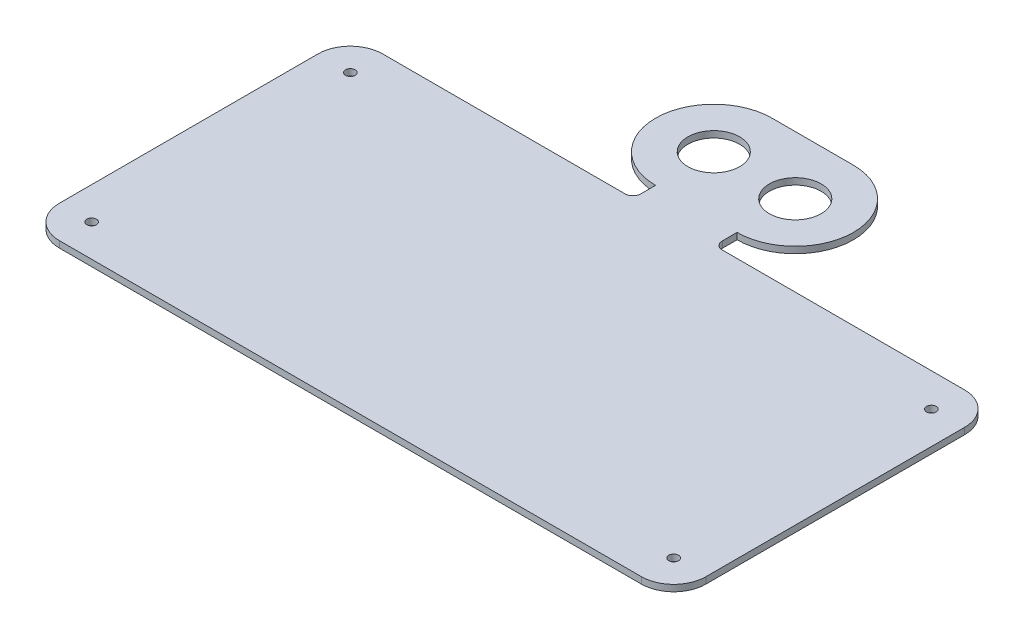
ISO-10303-21;
HEADER;
FILE_DESCRIPTION(('STEP AP214'),'2;1');
FILE_NAME('part.step','',(''),(''),'','','');
FILE_SCHEMA(('AUTOMOTIVE_DESIGN { 1 0 10303 214 1 1 1 1 }'));
ENDSEC;
DATA;
#1=APPLICATION_CONTEXT('core data for automotive mechanical design processes');
#2=APPLICATION_PROTOCOL_DEFINITION('international standard','automotive_design',2000,#1);
#3=PRODUCT_CONTEXT('',#1,'mechanical');
#4=PRODUCT('Part','Part','',(#3));
#5=PRODUCT_RELATED_PRODUCT_CATEGORY('part','',(#4));
#6=PRODUCT_DEFINITION_FORMATION('','',#4);
#7=PRODUCT_DEFINITION_CONTEXT('part definition',#1,'design');
#8=PRODUCT_DEFINITION('design','',#6,#7);
#9=PRODUCT_DEFINITION_SHAPE('','',#8);
#10=(LENGTH_UNIT() NAMED_UNIT(*) SI_UNIT(.MILLI.,.METRE.));
#11=(NAMED_UNIT(*) PLANE_ANGLE_UNIT() SI_UNIT($,.RADIAN.));
#12=(NAMED_UNIT(*) SI_UNIT($,.STERADIAN.) SOLID_ANGLE_UNIT());
#13=UNCERTAINTY_MEASURE_WITH_UNIT(LENGTH_MEASURE(1.E-05),#10,'distance_accuracy_value','');
#14=(GEOMETRIC_REPRESENTATION_CONTEXT(3) GLOBAL_UNCERTAINTY_ASSIGNED_CONTEXT((#13)) GLOBAL_UNIT_ASSIGNED_CONTEXT((#10,
#11,#12)) REPRESENTATION_CONTEXT('',''));
#15=CARTESIAN_POINT('',(0.,0.,0.));
#16=DIRECTION('',(0.,0.,1.));
#17=DIRECTION('',(1.,0.,0.));
#18=AXIS2_PLACEMENT_3D('',#15,#16,#17);
#19=CARTESIAN_POINT('',(0.00288129372301296,2.,-105.910949595272));
#20=DIRECTION('',(2.72048710067969E-05,0.,-0.999999999629947));
#21=DIRECTION('',(-0.999999999629948,0.,-2.72048710067969E-05));
#22=AXIS2_PLACEMENT_3D('',#19,#20,#21);
#23=PLANE('',#22);
#24=DIRECTION('',(0.999999999629948,0.,2.72048710067969E-05));
#25=VECTOR('',#24,1.);
#26=CARTESIAN_POINT('',(0.00288129372301296,0.,-105.910949595272));
#27=LINE('',#26,#25);
#28=CARTESIAN_POINT('',(34.5048266485384,0.,-105.910010974298));
#29=VERTEX_POINT('',#28);
#30=CARTESIAN_POINT('',(59.9279761931842,0.,-105.909319340794));
#31=VERTEX_POINT('',#30);
#32=EDGE_CURVE('E395',#29,#31,#27,.T.);
#33=ORIENTED_EDGE('',*,*,#32,.F.);
#34=DIRECTION('',(0.,-1.,0.));
#35=VECTOR('',#34,1.);
#36=CARTESIAN_POINT('',(34.5048266485384,2.,-105.910010974298));
#37=LINE('',#36,#35);
#38=CARTESIAN_POINT('',(34.5048266485384,2.,-105.910010974298));
#39=VERTEX_POINT('',#38);
#40=EDGE_CURVE('E12',#39,#29,#37,.T.);
#41=ORIENTED_EDGE('',*,*,#40,.F.);
#42=DIRECTION('',(0.999999999629948,0.,2.72048710067969E-05));
#43=VECTOR('',#42,1.);
#44=CARTESIAN_POINT('',(0.00288129372301296,2.,-105.910949595272));
#45=LINE('',#44,#43);
#46=CARTESIAN_POINT('',(59.9279761931842,2.,-105.909319340794));
#47=VERTEX_POINT('',#46);
#48=EDGE_CURVE('E319',#39,#47,#45,.T.);
#49=ORIENTED_EDGE('',*,*,#48,.T.);
#50=DIRECTION('',(0.,-1.,0.));
#51=VECTOR('',#50,1.);
#52=CARTESIAN_POINT('',(59.9279761931842,2.,-105.909319340794));
#53=LINE('',#52,#51);
#54=EDGE_CURVE('E145',#47,#31,#53,.T.);
#55=ORIENTED_EDGE('',*,*,#54,.T.);
#56=EDGE_LOOP('',(#33,#41,#49,#55));
#57=FACE_BOUND('',#56,.T.);
#58=ADVANCED_FACE('F47',(#57),#23,.T.);
#59=CARTESIAN_POINT('',(34.5048266485384,2.,-87.9100109876203));
#60=DIRECTION('',(0.,-1.,0.));
#61=DIRECTION('',(0.,0.,-1.));
#62=AXIS2_PLACEMENT_3D('',#59,#60,#61);
#63=CYLINDRICAL_SURFACE('',#62,17.9999999866781);
#64=CARTESIAN_POINT('',(34.5048266485384,0.,-87.9100109876203));
#65=DIRECTION('',(0.,1.,0.));
#66=DIRECTION('',(0.,0.,1.));
#67=AXIS2_PLACEMENT_3D('',#64,#65,#66);
#68=CIRCLE('',#67,17.9999999866781);
#69=CARTESIAN_POINT('',(34.5048266485384,0.,-69.9100110009422));
#70=VERTEX_POINT('',#69);
#71=EDGE_CURVE('E269',#29,#70,#68,.T.);
#72=ORIENTED_EDGE('',*,*,#71,.T.);
#73=DIRECTION('',(0.,-1.,0.));
#74=VECTOR('',#73,1.);
#75=CARTESIAN_POINT('',(34.5048266485384,2.,-69.9100110009422));
#76=LINE('',#75,#74);
#77=CARTESIAN_POINT('',(34.5048266485384,2.,-69.9100110009422));
#78=VERTEX_POINT('',#77);
#79=EDGE_CURVE('E59',#78,#70,#76,.T.);
#80=ORIENTED_EDGE('',*,*,#79,.F.);
#81=CARTESIAN_POINT('',(34.5048266485384,2.,-87.9100109876203));
#82=DIRECTION('',(0.,1.,0.));
#83=DIRECTION('',(0.,0.,1.));
#84=AXIS2_PLACEMENT_3D('',#81,#82,#83);
#85=CIRCLE('',#84,17.9999999866781);
#86=EDGE_CURVE('E313',#39,#78,#85,.T.);
#87=ORIENTED_EDGE('',*,*,#86,.F.);
#88=ORIENTED_EDGE('',*,*,#40,.T.);
#89=EDGE_LOOP('',(#72,#80,#87,#88));
#90=FACE_BOUND('',#89,.T.);
#91=ADVANCED_FACE('F454',(#90),#63,.T.);
#92=CARTESIAN_POINT('',(34.5048266485384,2.,0.));
#93=DIRECTION('',(1.,0.,0.));
#94=DIRECTION('',(0.,0.,-1.));
#95=AXIS2_PLACEMENT_3D('',#92,#93,#94);
#96=PLANE('',#95);
#97=DIRECTION('',(0.,0.,1.));
#98=VECTOR('',#97,1.);
#99=CARTESIAN_POINT('',(34.5048266485384,0.,0.));
#100=LINE('',#99,#98);
#101=CARTESIAN_POINT('',(34.5048266485384,0.,-65.3744840213346));
#102=VERTEX_POINT('',#101);
#103=EDGE_CURVE('E262',#70,#102,#100,.T.);
#104=ORIENTED_EDGE('',*,*,#103,.T.);
#105=DIRECTION('',(0.,-1.,0.));
#106=VECTOR('',#105,1.);
#107=CARTESIAN_POINT('',(34.5048266485384,2.,-65.3744840213346));
#108=LINE('',#107,#106);
#109=CARTESIAN_POINT('',(34.5048266485384,2.,-65.3744840213346));
#110=VERTEX_POINT('',#109);
#111=EDGE_CURVE('E301',#110,#102,#108,.T.);
#112=ORIENTED_EDGE('',*,*,#111,.F.);
#113=DIRECTION('',(0.,0.,1.));
#114=VECTOR('',#113,1.);
#115=CARTESIAN_POINT('',(34.5048266485384,2.,0.));
#116=LINE('',#115,#114);
#117=EDGE_CURVE('E318',#78,#110,#116,.T.);
#118=ORIENTED_EDGE('',*,*,#117,.F.);
#119=ORIENTED_EDGE('',*,*,#79,.T.);
#120=EDGE_LOOP('',(#104,#112,#118,#119));
#121=FACE_BOUND('',#120,.T.);
#122=ADVANCED_FACE('F459',(#121),#96,.F.);
#123=CARTESIAN_POINT('',(32.0178449764047,2.,-65.3744840213346));
#124=DIRECTION('',(0.,-1.,0.));
#125=DIRECTION('',(0.,0.,-1.));
#126=AXIS2_PLACEMENT_3D('',#123,#124,#125);
#127=CYLINDRICAL_SURFACE('',#126,2.48698167213371);
#128=CARTESIAN_POINT('',(32.0178449764047,0.,-65.3744840213346));
#129=DIRECTION('',(0.,1.,0.));
#130=DIRECTION('',(0.,0.,1.));
#131=AXIS2_PLACEMENT_3D('',#128,#129,#130);
#132=CIRCLE('',#131,2.48698167213371);
#133=CARTESIAN_POINT('',(32.3516870103431,0.,-62.9100109876203));
#134=VERTEX_POINT('',#133);
#135=EDGE_CURVE('E268',#102,#134,#132,.F.);
#136=ORIENTED_EDGE('',*,*,#135,.T.);
#137=DIRECTION('',(0.,-1.,0.));
#138=VECTOR('',#137,1.);
#139=CARTESIAN_POINT('',(32.3516870103431,2.,-62.9100109876203));
#140=LINE('',#139,#138);
#141=CARTESIAN_POINT('',(32.3516870103431,2.,-62.9100109876203));
#142=VERTEX_POINT('',#141);
#143=EDGE_CURVE('E295',#142,#134,#140,.T.);
#144=ORIENTED_EDGE('',*,*,#143,.F.);
#145=CARTESIAN_POINT('',(32.0178449764047,2.,-65.3744840213346));
#146=DIRECTION('',(0.,1.,0.));
#147=DIRECTION('',(0.,0.,1.));
#148=AXIS2_PLACEMENT_3D('',#145,#146,#147);
#149=CIRCLE('',#148,2.48698167213371);
#150=EDGE_CURVE('E326',#110,#142,#149,.F.);
#151=ORIENTED_EDGE('',*,*,#150,.F.);
#152=ORIENTED_EDGE('',*,*,#111,.T.);
#153=EDGE_LOOP('',(#136,#144,#151,#152));
#154=FACE_BOUND('',#153,.T.);
#155=ADVANCED_FACE('F729',(#154),#127,.F.);
#156=CARTESIAN_POINT('',(0.,2.,-62.9100109876203));
#157=DIRECTION('',(0.,0.,-1.));
#158=DIRECTION('',(-1.,0.,0.));
#159=AXIS2_PLACEMENT_3D('',#156,#157,#158);
#160=PLANE('',#159);
#161=DIRECTION('',(1.,0.,0.));
#162=VECTOR('',#161,1.);
#163=CARTESIAN_POINT('',(0.,0.,-62.9100109876203));
#164=LINE('',#163,#162);
#165=CARTESIAN_POINT('',(-42.8927873054641,0.,-62.9100109876203));
#166=VERTEX_POINT('',#165);
#167=EDGE_CURVE('E275',#166,#134,#164,.T.);
#168=ORIENTED_EDGE('',*,*,#167,.F.);
#169=DIRECTION('',(0.,-1.,0.));
#170=VECTOR('',#169,1.);
#171=CARTESIAN_POINT('',(-42.8927873054641,2.,-62.9100109876203));
#172=LINE('',#171,#170);
#173=CARTESIAN_POINT('',(-42.8927873054641,2.,-62.9100109876203));
#174=VERTEX_POINT('',#173);
#175=EDGE_CURVE('E291',#174,#166,#172,.T.);
#176=ORIENTED_EDGE('',*,*,#175,.F.);
#177=DIRECTION('',(1.,0.,0.));
#178=VECTOR('',#177,1.);
#179=CARTESIAN_POINT('',(0.,2.,-62.9100109876203));
#180=LINE('',#179,#178);
#181=EDGE_CURVE('E328',#174,#142,#180,.T.);
#182=ORIENTED_EDGE('',*,*,#181,.T.);
#183=ORIENTED_EDGE('',*,*,#143,.T.);
#184=EDGE_LOOP('',(#168,#176,#182,#183));
#185=FACE_BOUND('',#184,.T.);
#186=ADVANCED_FACE('F718',(#185),#160,.T.);
#187=CARTESIAN_POINT('',(-42.8927873054641,2.,-52.9100109876203));
#188=DIRECTION('',(0.,-1.,0.));
#189=DIRECTION('',(0.,0.,-1.));
#190=AXIS2_PLACEMENT_3D('',#187,#188,#189);
#191=CYLINDRICAL_SURFACE('',#190,9.99999999999999);
#192=CARTESIAN_POINT('',(-42.8927873054641,0.,-52.9100109876203));
#193=DIRECTION('',(0.,1.,0.));
#194=DIRECTION('',(0.,0.,1.));
#195=AXIS2_PLACEMENT_3D('',#192,#193,#194);
#196=CIRCLE('',#195,9.99999999999999);
#197=CARTESIAN_POINT('',(-52.8927873054641,0.,-52.9100109876203));
#198=VERTEX_POINT('',#197);
#199=EDGE_CURVE('E280',#166,#198,#196,.T.);
#200=ORIENTED_EDGE('',*,*,#199,.T.);
#201=DIRECTION('',(0.,-1.,0.));
#202=VECTOR('',#201,1.);
#203=CARTESIAN_POINT('',(-52.8927873054641,2.,-52.9100109876203));
#204=LINE('',#203,#202);
#205=CARTESIAN_POINT('',(-52.8927873054641,2.,-52.9100109876203));
#206=VERTEX_POINT('',#205);
#207=EDGE_CURVE('E296',#206,#198,#204,.T.);
#208=ORIENTED_EDGE('',*,*,#207,.F.);
#209=CARTESIAN_POINT('',(-42.8927873054641,2.,-52.9100109876203));
#210=DIRECTION('',(0.,1.,0.));
#211=DIRECTION('',(0.,0.,1.));
#212=AXIS2_PLACEMENT_3D('',#209,#210,#211);
#213=CIRCLE('',#212,9.99999999999999);
#214=EDGE_CURVE('E333',#174,#206,#213,.T.);
#215=ORIENTED_EDGE('',*,*,#214,.F.);
#216=ORIENTED_EDGE('',*,*,#175,.T.);
#217=EDGE_LOOP('',(#200,#208,#215,#216));
#218=FACE_BOUND('',#217,.T.);
#219=ADVANCED_FACE('F390',(#218),#191,.T.);
#220=CARTESIAN_POINT('',(-52.8927873054641,2.,0.));
#221=DIRECTION('',(1.,0.,0.));
#222=DIRECTION('',(0.,0.,-1.));
#223=AXIS2_PLACEMENT_3D('',#220,#221,#222);
#224=PLANE('',#223);
#225=DIRECTION('',(0.,0.,1.));
#226=VECTOR('',#225,1.);
#227=CARTESIAN_POINT('',(-52.8927873054641,0.,0.));
#228=LINE('',#227,#226);
#229=CARTESIAN_POINT('',(-52.8927873054641,0.,27.0899890123797));
#230=VERTEX_POINT('',#229);
#231=EDGE_CURVE('E346',#198,#230,#228,.T.);
#232=ORIENTED_EDGE('',*,*,#231,.T.);
#233=DIRECTION('',(0.,-1.,0.));
#234=VECTOR('',#233,1.);
#235=CARTESIAN_POINT('',(-52.8927873054641,2.,27.0899890123797));
#236=LINE('',#235,#234);
#237=CARTESIAN_POINT('',(-52.8927873054641,2.,27.0899890123797));
#238=VERTEX_POINT('',#237);
#239=EDGE_CURVE('E369',#238,#230,#236,.T.);
#240=ORIENTED_EDGE('',*,*,#239,.F.);
#241=DIRECTION('',(0.,0.,1.));
#242=VECTOR('',#241,1.);
#243=CARTESIAN_POINT('',(-52.8927873054641,2.,0.));
#244=LINE('',#243,#242);
#245=EDGE_CURVE('E338',#206,#238,#244,.T.);
#246=ORIENTED_EDGE('',*,*,#245,.F.);
#247=ORIENTED_EDGE('',*,*,#207,.T.);
#248=EDGE_LOOP('',(#232,#240,#246,#247));
#249=FACE_BOUND('',#248,.T.);
#250=ADVANCED_FACE('F385',(#249),#224,.F.);
#251=CARTESIAN_POINT('',(-42.8927873054641,2.,27.0899890123797));
#252=DIRECTION('',(0.,-1.,0.));
#253=DIRECTION('',(0.,0.,-1.));
#254=AXIS2_PLACEMENT_3D('',#251,#252,#253);
#255=CYLINDRICAL_SURFACE('',#254,10.);
#256=CARTESIAN_POINT('',(-42.8927873054641,0.,27.0899890123797));
#257=DIRECTION('',(0.,1.,0.));
#258=DIRECTION('',(0.,0.,1.));
#259=AXIS2_PLACEMENT_3D('',#256,#257,#258);
#260=CIRCLE('',#259,10.);
#261=CARTESIAN_POINT('',(-42.8927873054641,0.,37.0899890123797));
#262=VERTEX_POINT('',#261);
#263=EDGE_CURVE('E351',#230,#262,#260,.T.);
#264=ORIENTED_EDGE('',*,*,#263,.T.);
#265=DIRECTION('',(0.,-1.,0.));
#266=VECTOR('',#265,1.);
#267=CARTESIAN_POINT('',(-42.8927873054641,2.,37.0899890123797));
#268=LINE('',#267,#266);
#269=CARTESIAN_POINT('',(-42.8927873054641,2.,37.0899890123797));
#270=VERTEX_POINT('',#269);
#271=EDGE_CURVE('E364',#270,#262,#268,.T.);
#272=ORIENTED_EDGE('',*,*,#271,.F.);
#273=CARTESIAN_POINT('',(-42.8927873054641,2.,27.0899890123797));
#274=DIRECTION('',(0.,1.,0.));
#275=DIRECTION('',(0.,0.,1.));
#276=AXIS2_PLACEMENT_3D('',#273,#274,#275);
#277=CIRCLE('',#276,10.);
#278=EDGE_CURVE('E806',#238,#270,#277,.T.);
#279=ORIENTED_EDGE('',*,*,#278,.F.);
#280=ORIENTED_EDGE('',*,*,#239,.T.);
#281=EDGE_LOOP('',(#264,#272,#279,#280));
#282=FACE_BOUND('',#281,.T.);
#283=ADVANCED_FACE('F688',(#282),#255,.T.);
#284=CARTESIAN_POINT('',(0.,2.,37.0899890123797));
#285=DIRECTION('',(0.,0.,-1.));
#286=DIRECTION('',(-1.,0.,0.));
#287=AXIS2_PLACEMENT_3D('',#284,#285,#286);
#288=PLANE('',#287);
#289=DIRECTION('',(1.,0.,0.));
#290=VECTOR('',#289,1.);
#291=CARTESIAN_POINT('',(0.,0.,37.0899890123797));
#292=LINE('',#291,#290);
#293=CARTESIAN_POINT('',(137.102440602541,0.,37.0899890123797));
#294=VERTEX_POINT('',#293);
#295=EDGE_CURVE('E356',#262,#294,#292,.T.);
#296=ORIENTED_EDGE('',*,*,#295,.T.);
#297=DIRECTION('',(0.,-1.,0.));
#298=VECTOR('',#297,1.);
#299=CARTESIAN_POINT('',(137.102440602541,2.,37.0899890123797));
#300=LINE('',#299,#298);
#301=CARTESIAN_POINT('',(137.102440602541,2.,37.0899890123797));
#302=VERTEX_POINT('',#301);
#303=EDGE_CURVE('E370',#302,#294,#300,.T.);
#304=ORIENTED_EDGE('',*,*,#303,.F.);
#305=DIRECTION('',(1.,0.,0.));
#306=VECTOR('',#305,1.);
#307=CARTESIAN_POINT('',(0.,2.,37.0899890123797));
#308=LINE('',#307,#306);
#309=EDGE_CURVE('E809',#270,#302,#308,.T.);
#310=ORIENTED_EDGE('',*,*,#309,.F.);
#311=ORIENTED_EDGE('',*,*,#271,.T.);
#312=EDGE_LOOP('',(#296,#304,#310,#311));
#313=FACE_BOUND('',#312,.T.);
#314=ADVANCED_FACE('F676',(#313),#288,.F.);
#315=CARTESIAN_POINT('',(137.102440602541,2.,27.0899890123797));
#316=DIRECTION('',(0.,-1.,0.));
#317=DIRECTION('',(0.,0.,-1.));
#318=AXIS2_PLACEMENT_3D('',#315,#316,#317);
#319=CYLINDRICAL_SURFACE('',#318,9.99999999999999);
#320=CARTESIAN_POINT('',(137.102440602541,0.,27.0899890123797));
#321=DIRECTION('',(0.,1.,0.));
#322=DIRECTION('',(0.,0.,1.));
#323=AXIS2_PLACEMENT_3D('',#320,#321,#322);
#324=CIRCLE('',#323,9.99999999999999);
#325=CARTESIAN_POINT('',(147.102440602541,0.,27.0899890123797));
#326=VERTEX_POINT('',#325);
#327=EDGE_CURVE('E824',#294,#326,#324,.T.);
#328=ORIENTED_EDGE('',*,*,#327,.T.);
#329=DIRECTION('',(0.,-1.,0.));
#330=VECTOR('',#329,1.);
#331=CARTESIAN_POINT('',(147.102440602541,2.,27.0899890123797));
#332=LINE('',#331,#330);
#333=CARTESIAN_POINT('',(147.102440602541,2.,27.0899890123797));
#334=VERTEX_POINT('',#333);
#335=EDGE_CURVE('E845',#334,#326,#332,.T.);
#336=ORIENTED_EDGE('',*,*,#335,.F.);
#337=CARTESIAN_POINT('',(137.102440602541,2.,27.0899890123797));
#338=DIRECTION('',(0.,1.,0.));
#339=DIRECTION('',(0.,0.,1.));
#340=AXIS2_PLACEMENT_3D('',#337,#338,#339);
#341=CIRCLE('',#340,9.99999999999999);
#342=EDGE_CURVE('E812',#302,#334,#341,.T.);
#343=ORIENTED_EDGE('',*,*,#342,.F.);
#344=ORIENTED_EDGE('',*,*,#303,.T.);
#345=EDGE_LOOP('',(#328,#336,#343,#344));
#346=FACE_BOUND('',#345,.T.);
#347=ADVANCED_FACE('F664',(#346),#319,.T.);
#348=CARTESIAN_POINT('',(147.102440602541,2.,0.));
#349=DIRECTION('',(1.,0.,0.));
#350=DIRECTION('',(0.,0.,-1.));
#351=AXIS2_PLACEMENT_3D('',#348,#349,#350);
#352=PLANE('',#351);
#353=DIRECTION('',(0.,0.,1.));
#354=VECTOR('',#353,1.);
#355=CARTESIAN_POINT('',(147.102440602541,0.,0.));
#356=LINE('',#355,#354);
#357=CARTESIAN_POINT('',(147.102440602541,0.,-52.9100109876204));
#358=VERTEX_POINT('',#357);
#359=EDGE_CURVE('E829',#358,#326,#356,.T.);
#360=ORIENTED_EDGE('',*,*,#359,.F.);
#361=DIRECTION('',(0.,-1.,0.));
#362=VECTOR('',#361,1.);
#363=CARTESIAN_POINT('',(147.102440602541,2.,-52.9100109876204));
#364=LINE('',#363,#362);
#365=CARTESIAN_POINT('',(147.102440602541,2.,-52.9100109876204));
#366=VERTEX_POINT('',#365);
#367=EDGE_CURVE('E841',#366,#358,#364,.T.);
#368=ORIENTED_EDGE('',*,*,#367,.F.);
#369=DIRECTION('',(0.,0.,1.));
#370=VECTOR('',#369,1.);
#371=CARTESIAN_POINT('',(147.102440602541,2.,0.));
#372=LINE('',#371,#370);
#373=EDGE_CURVE('E863',#366,#334,#372,.T.);
#374=ORIENTED_EDGE('',*,*,#373,.T.);
#375=ORIENTED_EDGE('',*,*,#335,.T.);
#376=EDGE_LOOP('',(#360,#368,#374,#375));
#377=FACE_BOUND('',#376,.T.);
#378=ADVANCED_FACE('F653',(#377),#352,.T.);
#379=CARTESIAN_POINT('',(137.102440602541,2.,-52.9100109876204));
#380=DIRECTION('',(0.,-1.,0.));
#381=DIRECTION('',(0.,0.,-1.));
#382=AXIS2_PLACEMENT_3D('',#379,#380,#381);
#383=CYLINDRICAL_SURFACE('',#382,10.);
#384=CARTESIAN_POINT('',(137.102440602541,0.,-52.9100109876204));
#385=DIRECTION('',(0.,1.,0.));
#386=DIRECTION('',(0.,0.,1.));
#387=AXIS2_PLACEMENT_3D('',#384,#385,#386);
#388=CIRCLE('',#387,10.);
#389=CARTESIAN_POINT('',(137.102440602541,0.,-62.9100109876203));
#390=VERTEX_POINT('',#389);
#391=EDGE_CURVE('E834',#390,#358,#388,.F.);
#392=ORIENTED_EDGE('',*,*,#391,.F.);
#393=DIRECTION('',(0.,-1.,0.));
#394=VECTOR('',#393,1.);
#395=CARTESIAN_POINT('',(137.102440602541,2.,-62.9100109876203));
#396=LINE('',#395,#394);
#397=CARTESIAN_POINT('',(137.102440602541,2.,-62.9100109876203));
#398=VERTEX_POINT('',#397);
#399=EDGE_CURVE('E846',#398,#390,#396,.T.);
#400=ORIENTED_EDGE('',*,*,#399,.F.);
#401=CARTESIAN_POINT('',(137.102440602541,2.,-52.9100109876204));
#402=DIRECTION('',(0.,1.,0.));
#403=DIRECTION('',(0.,0.,1.));
#404=AXIS2_PLACEMENT_3D('',#401,#402,#403);
#405=CIRCLE('',#404,10.);
#406=EDGE_CURVE('E865',#398,#366,#405,.F.);
#407=ORIENTED_EDGE('',*,*,#406,.T.);
#408=ORIENTED_EDGE('',*,*,#367,.T.);
#409=EDGE_LOOP('',(#392,#400,#407,#408));
#410=FACE_BOUND('',#409,.T.);
#411=ADVANCED_FACE('F642',(#410),#383,.T.);
#412=CARTESIAN_POINT('',(0.,2.,-62.9100109876203));
#413=DIRECTION('',(0.,0.,-1.));
#414=DIRECTION('',(-1.,0.,0.));
#415=AXIS2_PLACEMENT_3D('',#412,#413,#414);
#416=PLANE('',#415);
#417=DIRECTION('',(1.,0.,0.));
#418=VECTOR('',#417,1.);
#419=CARTESIAN_POINT('',(0.,0.,-62.9100109876203));
#420=LINE('',#419,#418);
#421=CARTESIAN_POINT('',(61.7315969772552,0.,-62.9100109876203));
#422=VERTEX_POINT('',#421);
#423=EDGE_CURVE('E882',#422,#390,#420,.T.);
#424=ORIENTED_EDGE('',*,*,#423,.F.);
#425=DIRECTION('',(0.,-1.,0.));
#426=VECTOR('',#425,1.);
#427=CARTESIAN_POINT('',(61.7315969772552,2.,-62.9100109876203));
#428=LINE('',#427,#426);
#429=CARTESIAN_POINT('',(61.7315969772552,2.,-62.9100109876203));
#430=VERTEX_POINT('',#429);
#431=EDGE_CURVE('E212',#430,#422,#428,.T.);
#432=ORIENTED_EDGE('',*,*,#431,.F.);
#433=DIRECTION('',(1.,0.,0.));
#434=VECTOR('',#433,1.);
#435=CARTESIAN_POINT('',(0.,2.,-62.9100109876203));
#436=LINE('',#435,#434);
#437=EDGE_CURVE('E219',#430,#398,#436,.T.);
#438=ORIENTED_EDGE('',*,*,#437,.T.);
#439=ORIENTED_EDGE('',*,*,#399,.T.);
#440=EDGE_LOOP('',(#424,#432,#438,#439));
#441=FACE_BOUND('',#440,.T.);
#442=ADVANCED_FACE('F632',(#441),#416,.T.);
#443=CARTESIAN_POINT('',(62.2170525266609,2.,-65.374387634452));
#444=DIRECTION('',(0.,-1.,0.));
#445=DIRECTION('',(0.,0.,-1.));
#446=AXIS2_PLACEMENT_3D('',#443,#444,#445);
#447=CYLINDRICAL_SURFACE('',#446,2.51173632133191);
#448=CARTESIAN_POINT('',(62.2170525266609,0.,-65.374387634452));
#449=DIRECTION('',(0.,1.,0.));
#450=DIRECTION('',(0.,0.,1.));
#451=AXIS2_PLACEMENT_3D('',#448,#449,#450);
#452=CIRCLE('',#451,2.51173632133191);
#453=CARTESIAN_POINT('',(59.7053163270446,0.,-65.3751695776384));
#454=VERTEX_POINT('',#453);
#455=EDGE_CURVE('E206',#454,#422,#452,.T.);
#456=ORIENTED_EDGE('',*,*,#455,.F.);
#457=DIRECTION('',(0.,-1.,0.));
#458=VECTOR('',#457,1.);
#459=CARTESIAN_POINT('',(59.7053163270446,2.,-65.3751695776384));
#460=LINE('',#459,#458);
#461=CARTESIAN_POINT('',(59.7053163270446,2.,-65.3751695776384));
#462=VERTEX_POINT('',#461);
#463=EDGE_CURVE('E201',#462,#454,#460,.T.);
#464=ORIENTED_EDGE('',*,*,#463,.F.);
#465=CARTESIAN_POINT('',(62.2170525266609,2.,-65.374387634452));
#466=DIRECTION('',(0.,1.,0.));
#467=DIRECTION('',(0.,0.,1.));
#468=AXIS2_PLACEMENT_3D('',#465,#466,#467);
#469=CIRCLE('',#468,2.51173632133191);
#470=EDGE_CURVE('E204',#462,#430,#469,.T.);
#471=ORIENTED_EDGE('',*,*,#470,.T.);
#472=ORIENTED_EDGE('',*,*,#431,.T.);
#473=EDGE_LOOP('',(#456,#464,#471,#472));
#474=FACE_BOUND('',#473,.T.);
#475=ADVANCED_FACE('F203',(#474),#447,.F.);
#476=CARTESIAN_POINT('',(59.7053163270445,2.,0.));
#477=DIRECTION('',(1.,0.,0.));
#478=DIRECTION('',(0.,0.,-1.));
#479=AXIS2_PLACEMENT_3D('',#476,#477,#478);
#480=PLANE('',#479);
#481=DIRECTION('',(0.,0.,1.));
#482=VECTOR('',#481,1.);
#483=CARTESIAN_POINT('',(59.7053163270445,0.,0.));
#484=LINE('',#483,#482);
#485=CARTESIAN_POINT('',(59.7053163270446,0.,-69.9106965439242));
#486=VERTEX_POINT('',#485);
#487=EDGE_CURVE('E247',#486,#454,#484,.T.);
#488=ORIENTED_EDGE('',*,*,#487,.F.);
#489=DIRECTION('',(0.,-1.,0.));
#490=VECTOR('',#489,1.);
#491=CARTESIAN_POINT('',(59.7053163270446,2.,-69.9106965439242));
#492=LINE('',#491,#490);
#493=CARTESIAN_POINT('',(59.7053163270446,2.,-69.9106965439242));
#494=VERTEX_POINT('',#493);
#495=EDGE_CURVE('E137',#494,#486,#492,.T.);
#496=ORIENTED_EDGE('',*,*,#495,.F.);
#497=DIRECTION('',(0.,0.,1.));
#498=VECTOR('',#497,1.);
#499=CARTESIAN_POINT('',(59.7053163270445,2.,0.));
#500=LINE('',#499,#498);
#501=EDGE_CURVE('E216',#494,#462,#500,.T.);
#502=ORIENTED_EDGE('',*,*,#501,.T.);
#503=ORIENTED_EDGE('',*,*,#463,.T.);
#504=EDGE_LOOP('',(#488,#496,#502,#503));
#505=FACE_BOUND('',#504,.T.);
#506=ADVANCED_FACE('F222',(#505),#480,.T.);
#507=CARTESIAN_POINT('',(-42.8927873054641,2.,27.0899890123797));
#508=DIRECTION('',(0.,-1.,0.));
#509=DIRECTION('',(0.,0.,-1.));
#510=AXIS2_PLACEMENT_3D('',#507,#508,#509);
#511=CYLINDRICAL_SURFACE('',#510,1.5);
#512=CARTESIAN_POINT('',(-42.8927873054641,2.,27.0899890123797));
#513=DIRECTION('',(0.,1.,0.));
#514=DIRECTION('',(0.,0.,1.));
#515=AXIS2_PLACEMENT_3D('',#512,#513,#514);
#516=CIRCLE('',#515,1.5);
#517=CARTESIAN_POINT('',(-42.8927873054641,2.,28.5899890123797));
#518=VERTEX_POINT('',#517);
#519=EDGE_CURVE('E397',#518,#518,#516,.T.);
#520=ORIENTED_EDGE('',*,*,#519,.T.);
#521=EDGE_LOOP('',(#520));
#522=FACE_BOUND('',#521,.T.);
#523=CARTESIAN_POINT('',(-42.8927873054641,0.,27.0899890123797));
#524=DIRECTION('',(0.,1.,0.));
#525=DIRECTION('',(0.,0.,1.));
#526=AXIS2_PLACEMENT_3D('',#523,#524,#525);
#527=CIRCLE('',#526,1.5);
#528=CARTESIAN_POINT('',(-42.8927873054641,0.,28.5899890123797));
#529=VERTEX_POINT('',#528);
#530=EDGE_CURVE('E400',#529,#529,#527,.T.);
#531=ORIENTED_EDGE('',*,*,#530,.F.);
#532=EDGE_LOOP('',(#531));
#533=FACE_BOUND('',#532,.T.);
#534=ADVANCED_FACE('F467',(#522,#533),#511,.F.);
#535=CARTESIAN_POINT('',(-42.8927873054641,2.,-52.9100109876203));
#536=DIRECTION('',(0.,-1.,0.));
#537=DIRECTION('',(0.,0.,-1.));
#538=AXIS2_PLACEMENT_3D('',#535,#536,#537);
#539=CYLINDRICAL_SURFACE('',#538,1.5);
#540=CARTESIAN_POINT('',(-42.8927873054641,2.,-52.9100109876203));
#541=DIRECTION('',(0.,1.,0.));
#542=DIRECTION('',(0.,0.,1.));
#543=AXIS2_PLACEMENT_3D('',#540,#541,#542);
#544=CIRCLE('',#543,1.5);
#545=CARTESIAN_POINT('',(-42.8927873054641,2.,-51.4100109876203));
#546=VERTEX_POINT('',#545);
#547=EDGE_CURVE('E516',#546,#546,#544,.T.);
#548=ORIENTED_EDGE('',*,*,#547,.T.);
#549=EDGE_LOOP('',(#548));
#550=FACE_BOUND('',#549,.T.);
#551=CARTESIAN_POINT('',(-42.8927873054641,0.,-52.9100109876203));
#552=DIRECTION('',(0.,1.,0.));
#553=DIRECTION('',(0.,0.,1.));
#554=AXIS2_PLACEMENT_3D('',#551,#552,#553);
#555=CIRCLE('',#554,1.5);
#556=CARTESIAN_POINT('',(-42.8927873054641,0.,-51.4100109876203));
#557=VERTEX_POINT('',#556);
#558=EDGE_CURVE('E404',#557,#557,#555,.T.);
#559=ORIENTED_EDGE('',*,*,#558,.F.);
#560=EDGE_LOOP('',(#559));
#561=FACE_BOUND('',#560,.T.);
#562=ADVANCED_FACE('F472',(#550,#561),#539,.F.);
#563=CARTESIAN_POINT('',(34.5048266485384,2.,-87.9100109876203));
#564=DIRECTION('',(0.,-1.,0.));
#565=DIRECTION('',(0.,0.,-1.));
#566=AXIS2_PLACEMENT_3D('',#563,#564,#565);
#567=CYLINDRICAL_SURFACE('',#566,8.);
#568=CARTESIAN_POINT('',(34.5048266485384,2.,-87.9100109876203));
#569=DIRECTION('',(0.,1.,0.));
#570=DIRECTION('',(0.,0.,1.));
#571=AXIS2_PLACEMENT_3D('',#568,#569,#570);
#572=CIRCLE('',#571,8.);
#573=CARTESIAN_POINT('',(34.5048266485384,2.,-79.9100109876203));
#574=VERTEX_POINT('',#573);
#575=EDGE_CURVE('E512',#574,#574,#572,.T.);
#576=ORIENTED_EDGE('',*,*,#575,.T.);
#577=EDGE_LOOP('',(#576));
#578=FACE_BOUND('',#577,.T.);
#579=CARTESIAN_POINT('',(34.5048266485384,0.,-87.9100109876203));
#580=DIRECTION('',(0.,1.,0.));
#581=DIRECTION('',(0.,0.,1.));
#582=AXIS2_PLACEMENT_3D('',#579,#580,#581);
#583=CIRCLE('',#582,8.);
#584=CARTESIAN_POINT('',(34.5048266485384,0.,-79.9100109876203));
#585=VERTEX_POINT('',#584);
#586=EDGE_CURVE('E418',#585,#585,#583,.T.);
#587=ORIENTED_EDGE('',*,*,#586,.F.);
#588=EDGE_LOOP('',(#587));
#589=FACE_BOUND('',#588,.T.);
#590=ADVANCED_FACE('F477',(#578,#589),#567,.F.);
#591=CARTESIAN_POINT('',(59.7053163270446,2.,-87.9106965439242));
#592=DIRECTION('',(0.,-1.,0.));
#593=DIRECTION('',(0.,0.,-1.));
#594=AXIS2_PLACEMENT_3D('',#591,#592,#593);
#595=CYLINDRICAL_SURFACE('',#594,8.00000000000001);
#596=CARTESIAN_POINT('',(59.7053163270446,2.,-87.9106965439242));
#597=DIRECTION('',(0.,1.,0.));
#598=DIRECTION('',(0.,0.,1.));
#599=AXIS2_PLACEMENT_3D('',#596,#597,#598);
#600=CIRCLE('',#599,8.00000000000001);
#601=CARTESIAN_POINT('',(59.7053163270446,2.,-79.9106965439242));
#602=VERTEX_POINT('',#601);
#603=EDGE_CURVE('E508',#602,#602,#600,.T.);
#604=ORIENTED_EDGE('',*,*,#603,.T.);
#605=EDGE_LOOP('',(#604));
#606=FACE_BOUND('',#605,.T.);
#607=CARTESIAN_POINT('',(59.7053163270446,0.,-87.9106965439242));
#608=DIRECTION('',(0.,1.,0.));
#609=DIRECTION('',(0.,0.,1.));
#610=AXIS2_PLACEMENT_3D('',#607,#608,#609);
#611=CIRCLE('',#610,8.00000000000001);
#612=CARTESIAN_POINT('',(59.7053163270446,0.,-79.9106965439242));
#613=VERTEX_POINT('',#612);
#614=EDGE_CURVE('E422',#613,#613,#611,.T.);
#615=ORIENTED_EDGE('',*,*,#614,.F.);
#616=EDGE_LOOP('',(#615));
#617=FACE_BOUND('',#616,.T.);
#618=ADVANCED_FACE('F450',(#606,#617),#595,.F.);
#619=CARTESIAN_POINT('',(137.102440602541,2.,27.0899890123797));
#620=DIRECTION('',(0.,-1.,0.));
#621=DIRECTION('',(0.,0.,-1.));
#622=AXIS2_PLACEMENT_3D('',#619,#620,#621);
#623=CYLINDRICAL_SURFACE('',#622,1.5);
#624=CARTESIAN_POINT('',(137.102440602541,2.,27.0899890123797));
#625=DIRECTION('',(0.,1.,0.));
#626=DIRECTION('',(0.,0.,1.));
#627=AXIS2_PLACEMENT_3D('',#624,#625,#626);
#628=CIRCLE('',#627,1.5);
#629=CARTESIAN_POINT('',(137.102440602541,2.,28.5899890123797));
#630=VERTEX_POINT('',#629);
#631=EDGE_CURVE('E504',#630,#630,#628,.T.);
#632=ORIENTED_EDGE('',*,*,#631,.T.);
#633=EDGE_LOOP('',(#632));
#634=FACE_BOUND('',#633,.T.);
#635=CARTESIAN_POINT('',(137.102440602541,0.,27.0899890123797));
#636=DIRECTION('',(0.,1.,0.));
#637=DIRECTION('',(0.,0.,1.));
#638=AXIS2_PLACEMENT_3D('',#635,#636,#637);
#639=CIRCLE('',#638,1.5);
#640=CARTESIAN_POINT('',(137.102440602541,0.,28.5899890123797));
#641=VERTEX_POINT('',#640);
#642=EDGE_CURVE('E427',#641,#641,#639,.T.);
#643=ORIENTED_EDGE('',*,*,#642,.F.);
#644=EDGE_LOOP('',(#643));
#645=FACE_BOUND('',#644,.T.);
#646=ADVANCED_FACE('F443',(#634,#645),#623,.F.);
#647=CARTESIAN_POINT('',(137.102440602541,2.,-52.6129266609712));
#648=DIRECTION('',(0.,-1.,0.));
#649=DIRECTION('',(0.,0.,-1.));
#650=AXIS2_PLACEMENT_3D('',#647,#648,#649);
#651=CYLINDRICAL_SURFACE('',#650,1.5);
#652=CARTESIAN_POINT('',(137.102440602541,2.,-52.6129266609712));
#653=DIRECTION('',(0.,1.,0.));
#654=DIRECTION('',(0.,0.,1.));
#655=AXIS2_PLACEMENT_3D('',#652,#653,#654);
#656=CIRCLE('',#655,1.5);
#657=CARTESIAN_POINT('',(137.102440602541,2.,-51.1129266609712));
#658=VERTEX_POINT('',#657);
#659=EDGE_CURVE('E246',#658,#658,#656,.T.);
#660=ORIENTED_EDGE('',*,*,#659,.T.);
#661=EDGE_LOOP('',(#660));
#662=FACE_BOUND('',#661,.T.);
#663=CARTESIAN_POINT('',(137.102440602541,0.,-52.6129266609712));
#664=DIRECTION('',(0.,1.,0.));
#665=DIRECTION('',(0.,0.,1.));
#666=AXIS2_PLACEMENT_3D('',#663,#664,#665);
#667=CIRCLE('',#666,1.5);
#668=CARTESIAN_POINT('',(137.102440602541,0.,-51.1129266609712));
#669=VERTEX_POINT('',#668);
#670=EDGE_CURVE('E431',#669,#669,#667,.T.);
#671=ORIENTED_EDGE('',*,*,#670,.F.);
#672=EDGE_LOOP('',(#671));
#673=FACE_BOUND('',#672,.T.);
#674=ADVANCED_FACE('F50',(#662,#673),#651,.F.);
#675=CARTESIAN_POINT('',(59.7053163270446,2.,-87.9106965439242));
#676=DIRECTION('',(0.,-1.,0.));
#677=DIRECTION('',(0.,0.,-1.));
#678=AXIS2_PLACEMENT_3D('',#675,#676,#677);
#679=CYLINDRICAL_SURFACE('',#678,18.);
#680=CARTESIAN_POINT('',(59.7053163270446,0.,-87.9106965439242));
#681=DIRECTION('',(0.,1.,0.));
#682=DIRECTION('',(0.,0.,1.));
#683=AXIS2_PLACEMENT_3D('',#680,#681,#682);
#684=CIRCLE('',#683,18.);
#685=EDGE_CURVE('E241',#486,#31,#684,.T.);
#686=ORIENTED_EDGE('',*,*,#685,.T.);
#687=ORIENTED_EDGE('',*,*,#54,.F.);
#688=CARTESIAN_POINT('',(59.7053163270446,2.,-87.9106965439242));
#689=DIRECTION('',(0.,1.,0.));
#690=DIRECTION('',(0.,0.,1.));
#691=AXIS2_PLACEMENT_3D('',#688,#689,#690);
#692=CIRCLE('',#691,18.);
#693=EDGE_CURVE('E70',#494,#47,#692,.T.);
#694=ORIENTED_EDGE('',*,*,#693,.F.);
#695=ORIENTED_EDGE('',*,*,#495,.T.);
#696=EDGE_LOOP('',(#686,#687,#694,#695));
#697=FACE_BOUND('',#696,.T.);
#698=ADVANCED_FACE('F442',(#697),#679,.T.);
#699=CARTESIAN_POINT('',(0.,2.,0.));
#700=DIRECTION('',(0.,1.,0.));
#701=DIRECTION('',(0.,0.,1.));
#702=AXIS2_PLACEMENT_3D('',#699,#700,#701);
#703=PLANE('',#702);
#704=ORIENTED_EDGE('',*,*,#659,.F.);
#705=EDGE_LOOP('',(#704));
#706=FACE_BOUND('',#705,.T.);
#707=ORIENTED_EDGE('',*,*,#631,.F.);
#708=EDGE_LOOP('',(#707));
#709=FACE_BOUND('',#708,.T.);
#710=ORIENTED_EDGE('',*,*,#603,.F.);
#711=EDGE_LOOP('',(#710));
#712=FACE_BOUND('',#711,.T.);
#713=ORIENTED_EDGE('',*,*,#575,.F.);
#714=EDGE_LOOP('',(#713));
#715=FACE_BOUND('',#714,.T.);
#716=ORIENTED_EDGE('',*,*,#547,.F.);
#717=EDGE_LOOP('',(#716));
#718=FACE_BOUND('',#717,.T.);
#719=ORIENTED_EDGE('',*,*,#519,.F.);
#720=EDGE_LOOP('',(#719));
#721=FACE_BOUND('',#720,.T.);
#722=ORIENTED_EDGE('',*,*,#48,.F.);
#723=ORIENTED_EDGE('',*,*,#86,.T.);
#724=ORIENTED_EDGE('',*,*,#117,.T.);
#725=ORIENTED_EDGE('',*,*,#150,.T.);
#726=ORIENTED_EDGE('',*,*,#181,.F.);
#727=ORIENTED_EDGE('',*,*,#214,.T.);
#728=ORIENTED_EDGE('',*,*,#245,.T.);
#729=ORIENTED_EDGE('',*,*,#278,.T.);
#730=ORIENTED_EDGE('',*,*,#309,.T.);
#731=ORIENTED_EDGE('',*,*,#342,.T.);
#732=ORIENTED_EDGE('',*,*,#373,.F.);
#733=ORIENTED_EDGE('',*,*,#406,.F.);
#734=ORIENTED_EDGE('',*,*,#437,.F.);
#735=ORIENTED_EDGE('',*,*,#470,.F.);
#736=ORIENTED_EDGE('',*,*,#501,.F.);
#737=ORIENTED_EDGE('',*,*,#693,.T.);
#738=EDGE_LOOP('',(#722,#723,#724,#725,#726,#727,#728,#729,#730,#731,#732,#733,#734,#735,#736,#737));
#739=FACE_BOUND('',#738,.T.);
#740=ADVANCED_FACE('F215',(#706,#709,#712,#715,#718,#721,#739),#703,.T.);
#741=CARTESIAN_POINT('',(0.,0.,0.));
#742=DIRECTION('',(0.,1.,0.));
#743=DIRECTION('',(0.,0.,1.));
#744=AXIS2_PLACEMENT_3D('',#741,#742,#743);
#745=PLANE('',#744);
#746=ORIENTED_EDGE('',*,*,#670,.T.);
#747=EDGE_LOOP('',(#746));
#748=FACE_BOUND('',#747,.T.);
#749=ORIENTED_EDGE('',*,*,#642,.T.);
#750=EDGE_LOOP('',(#749));
#751=FACE_BOUND('',#750,.T.);
#752=ORIENTED_EDGE('',*,*,#614,.T.);
#753=EDGE_LOOP('',(#752));
#754=FACE_BOUND('',#753,.T.);
#755=ORIENTED_EDGE('',*,*,#586,.T.);
#756=EDGE_LOOP('',(#755));
#757=FACE_BOUND('',#756,.T.);
#758=ORIENTED_EDGE('',*,*,#558,.T.);
#759=EDGE_LOOP('',(#758));
#760=FACE_BOUND('',#759,.T.);
#761=ORIENTED_EDGE('',*,*,#530,.T.);
#762=EDGE_LOOP('',(#761));
#763=FACE_BOUND('',#762,.T.);
#764=ORIENTED_EDGE('',*,*,#32,.T.);
#765=ORIENTED_EDGE('',*,*,#685,.F.);
#766=ORIENTED_EDGE('',*,*,#487,.T.);
#767=ORIENTED_EDGE('',*,*,#455,.T.);
#768=ORIENTED_EDGE('',*,*,#423,.T.);
#769=ORIENTED_EDGE('',*,*,#391,.T.);
#770=ORIENTED_EDGE('',*,*,#359,.T.);
#771=ORIENTED_EDGE('',*,*,#327,.F.);
#772=ORIENTED_EDGE('',*,*,#295,.F.);
#773=ORIENTED_EDGE('',*,*,#263,.F.);
#774=ORIENTED_EDGE('',*,*,#231,.F.);
#775=ORIENTED_EDGE('',*,*,#199,.F.);
#776=ORIENTED_EDGE('',*,*,#167,.T.);
#777=ORIENTED_EDGE('',*,*,#135,.F.);
#778=ORIENTED_EDGE('',*,*,#103,.F.);
#779=ORIENTED_EDGE('',*,*,#71,.F.);
#780=EDGE_LOOP('',(#764,#765,#766,#767,#768,#769,#770,#771,#772,#773,#774,#775,#776,#777,#778,#779));
#781=FACE_BOUND('',#780,.T.);
#782=ADVANCED_FACE('F438',(#748,#751,#754,#757,#760,#763,#781),#745,.F.);
#783=CLOSED_SHELL('',(#58,#91,#122,#155,#186,#219,#250,#283,#314,#347,#378,#411,#442,#475,#506,
#534,#562,#590,#618,#646,#674,#698,#740,#782));
#784=MANIFOLD_SOLID_BREP('B2',#783);
#785=ADVANCED_BREP_SHAPE_REPRESENTATION('',(#18,#784),#14);
#786=SHAPE_DEFINITION_REPRESENTATION(#9,#785);
ENDSEC;
END-ISO-10303-21;
